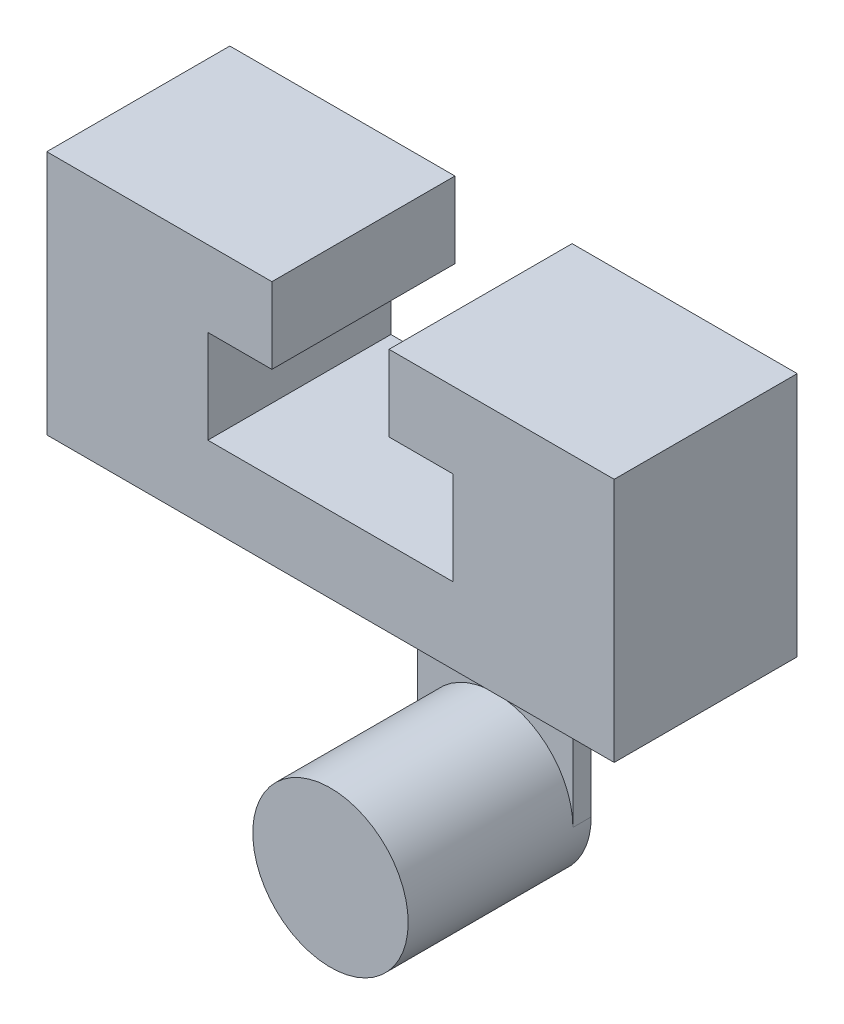
ISO-10303-21;
HEADER;
FILE_DESCRIPTION(('STEP AP214'),'2;1');
FILE_NAME('part.step','',(''),(''),'','','');
FILE_SCHEMA(('AUTOMOTIVE_DESIGN { 1 0 10303 214 1 1 1 1 }'));
ENDSEC;
DATA;
#1=APPLICATION_CONTEXT('core data for automotive mechanical design processes');
#2=APPLICATION_PROTOCOL_DEFINITION('international standard','automotive_design',2000,#1);
#3=PRODUCT_CONTEXT('',#1,'mechanical');
#4=PRODUCT('Part','Part','',(#3));
#5=PRODUCT_RELATED_PRODUCT_CATEGORY('part','',(#4));
#6=PRODUCT_DEFINITION_FORMATION('','',#4);
#7=PRODUCT_DEFINITION_CONTEXT('part definition',#1,'design');
#8=PRODUCT_DEFINITION('design','',#6,#7);
#9=PRODUCT_DEFINITION_SHAPE('','',#8);
#10=(LENGTH_UNIT() NAMED_UNIT(*) SI_UNIT(.MILLI.,.METRE.));
#11=(NAMED_UNIT(*) PLANE_ANGLE_UNIT() SI_UNIT($,.RADIAN.));
#12=(NAMED_UNIT(*) SI_UNIT($,.STERADIAN.) SOLID_ANGLE_UNIT());
#13=UNCERTAINTY_MEASURE_WITH_UNIT(LENGTH_MEASURE(1.E-05),#10,'distance_accuracy_value','');
#14=(GEOMETRIC_REPRESENTATION_CONTEXT(3) GLOBAL_UNCERTAINTY_ASSIGNED_CONTEXT((#13)) GLOBAL_UNIT_ASSIGNED_CONTEXT((#10,
#11,#12)) REPRESENTATION_CONTEXT('',''));
#15=CARTESIAN_POINT('',(0.,0.,0.));
#16=DIRECTION('',(0.,0.,1.));
#17=DIRECTION('',(1.,0.,0.));
#18=AXIS2_PLACEMENT_3D('',#15,#16,#17);
#19=CARTESIAN_POINT('',(50.1523,-33.528,25.4));
#20=DIRECTION('',(-1.,0.,0.));
#21=DIRECTION('',(0.,0.,1.));
#22=AXIS2_PLACEMENT_3D('',#19,#20,#21);
#23=PLANE('',#22);
#24=DIRECTION('',(0.,1.,0.));
#25=VECTOR('',#24,1.);
#26=CARTESIAN_POINT('',(50.1523,0.,2.54));
#27=LINE('',#26,#25);
#28=CARTESIAN_POINT('',(50.1523,-33.528,2.54));
#29=VERTEX_POINT('',#28);
#30=CARTESIAN_POINT('',(50.1523,0.,2.54));
#31=VERTEX_POINT('',#30);
#32=EDGE_CURVE('E200',#29,#31,#27,.T.);
#33=ORIENTED_EDGE('',*,*,#32,.F.);
#34=DIRECTION('',(0.,0.,-1.));
#35=VECTOR('',#34,1.);
#36=CARTESIAN_POINT('',(50.1523,-33.528,25.4));
#37=LINE('',#36,#35);
#38=CARTESIAN_POINT('',(50.1523,-33.528,0.));
#39=VERTEX_POINT('',#38);
#40=EDGE_CURVE('E13',#29,#39,#37,.T.);
#41=ORIENTED_EDGE('',*,*,#40,.T.);
#42=DIRECTION('',(0.,1.,0.));
#43=VECTOR('',#42,1.);
#44=CARTESIAN_POINT('',(50.1523,-33.528,0.));
#45=LINE('',#44,#43);
#46=CARTESIAN_POINT('',(50.1523,0.,0.));
#47=VERTEX_POINT('',#46);
#48=EDGE_CURVE('E233',#39,#47,#45,.T.);
#49=ORIENTED_EDGE('',*,*,#48,.T.);
#50=DIRECTION('',(0.,0.,-1.));
#51=VECTOR('',#50,1.);
#52=CARTESIAN_POINT('',(50.1523,0.,25.4));
#53=LINE('',#52,#51);
#54=EDGE_CURVE('E76',#31,#47,#53,.T.);
#55=ORIENTED_EDGE('',*,*,#54,.F.);
#56=EDGE_LOOP('',(#33,#41,#49,#55));
#57=FACE_BOUND('',#56,.T.);
#58=ADVANCED_FACE('F72',(#57),#23,.F.);
#59=CARTESIAN_POINT('',(39.37,-33.528,25.4));
#60=DIRECTION('',(0.,0.,-1.));
#61=DIRECTION('',(-1.,0.,0.));
#62=AXIS2_PLACEMENT_3D('',#59,#60,#61);
#63=CYLINDRICAL_SURFACE('',#62,10.7823);
#64=ORIENTED_EDGE('',*,*,#40,.F.);
#65=CARTESIAN_POINT('',(39.37,-33.528,2.54));
#66=DIRECTION('',(0.,0.,1.));
#67=DIRECTION('',(1.,0.,0.));
#68=AXIS2_PLACEMENT_3D('',#65,#66,#67);
#69=CIRCLE('',#68,10.7823);
#70=CARTESIAN_POINT('',(28.5877,-33.528,2.54));
#71=VERTEX_POINT('',#70);
#72=EDGE_CURVE('E191',#29,#71,#69,.T.);
#73=ORIENTED_EDGE('',*,*,#72,.T.);
#74=DIRECTION('',(0.,0.,-1.));
#75=VECTOR('',#74,1.);
#76=CARTESIAN_POINT('',(28.5877,-33.528,25.4));
#77=LINE('',#76,#75);
#78=CARTESIAN_POINT('',(28.5877,-33.528,0.));
#79=VERTEX_POINT('',#78);
#80=EDGE_CURVE('E129',#71,#79,#77,.T.);
#81=ORIENTED_EDGE('',*,*,#80,.T.);
#82=CARTESIAN_POINT('',(39.37,-33.528,0.));
#83=DIRECTION('',(0.,0.,1.));
#84=DIRECTION('',(1.,0.,0.));
#85=AXIS2_PLACEMENT_3D('',#82,#83,#84);
#86=CIRCLE('',#85,10.7823);
#87=EDGE_CURVE('E192',#79,#39,#86,.T.);
#88=ORIENTED_EDGE('',*,*,#87,.T.);
#89=EDGE_LOOP('',(#64,#73,#81,#88));
#90=FACE_BOUND('',#89,.T.);
#91=CARTESIAN_POINT('',(39.37,-33.528,25.4));
#92=DIRECTION('',(0.,0.,1.));
#93=DIRECTION('',(1.,0.,0.));
#94=AXIS2_PLACEMENT_3D('',#91,#92,#93);
#95=CIRCLE('',#94,10.7823);
#96=CARTESIAN_POINT('',(50.1523,-33.528,25.4));
#97=VERTEX_POINT('',#96);
#98=EDGE_CURVE('E207',#97,#97,#95,.T.);
#99=ORIENTED_EDGE('',*,*,#98,.F.);
#100=EDGE_LOOP('',(#99));
#101=FACE_BOUND('',#100,.T.);
#102=ADVANCED_FACE('F71',(#90,#101),#63,.T.);
#103=CARTESIAN_POINT('',(0.,34.036,25.4));
#104=DIRECTION('',(0.,1.,0.));
#105=DIRECTION('',(0.,0.,1.));
#106=AXIS2_PLACEMENT_3D('',#103,#104,#105);
#107=PLANE('',#106);
#108=DIRECTION('',(1.,0.,0.));
#109=VECTOR('',#108,1.);
#110=CARTESIAN_POINT('',(0.,34.036,0.));
#111=LINE('',#110,#109);
#112=CARTESIAN_POINT('',(47.498,34.036,0.));
#113=VERTEX_POINT('',#112);
#114=CARTESIAN_POINT('',(78.74,34.036,0.));
#115=VERTEX_POINT('',#114);
#116=EDGE_CURVE('E244',#113,#115,#111,.T.);
#117=ORIENTED_EDGE('',*,*,#116,.F.);
#118=DIRECTION('',(0.,0.,1.));
#119=VECTOR('',#118,1.);
#120=CARTESIAN_POINT('',(47.498,34.036,0.));
#121=LINE('',#120,#119);
#122=CARTESIAN_POINT('',(47.498,34.036,25.4));
#123=VERTEX_POINT('',#122);
#124=EDGE_CURVE('E395',#113,#123,#121,.T.);
#125=ORIENTED_EDGE('',*,*,#124,.T.);
#126=DIRECTION('',(1.,0.,0.));
#127=VECTOR('',#126,1.);
#128=CARTESIAN_POINT('',(0.,34.036,25.4));
#129=LINE('',#128,#127);
#130=CARTESIAN_POINT('',(78.74,34.036,25.4));
#131=VERTEX_POINT('',#130);
#132=EDGE_CURVE('E297',#123,#131,#129,.T.);
#133=ORIENTED_EDGE('',*,*,#132,.T.);
#134=DIRECTION('',(0.,0.,-1.));
#135=VECTOR('',#134,1.);
#136=CARTESIAN_POINT('',(78.74,34.036,25.4));
#137=LINE('',#136,#135);
#138=EDGE_CURVE('E275',#131,#115,#137,.T.);
#139=ORIENTED_EDGE('',*,*,#138,.T.);
#140=EDGE_LOOP('',(#117,#125,#133,#139));
#141=FACE_BOUND('',#140,.T.);
#142=ADVANCED_FACE('F418',(#141),#107,.T.);
#143=CARTESIAN_POINT('',(78.74,0.,25.4));
#144=DIRECTION('',(-1.,0.,0.));
#145=DIRECTION('',(0.,0.,1.));
#146=AXIS2_PLACEMENT_3D('',#143,#144,#145);
#147=PLANE('',#146);
#148=DIRECTION('',(0.,1.,0.));
#149=VECTOR('',#148,1.);
#150=CARTESIAN_POINT('',(78.74,0.,0.));
#151=LINE('',#150,#149);
#152=CARTESIAN_POINT('',(78.74,0.,0.));
#153=VERTEX_POINT('',#152);
#154=EDGE_CURVE('E238',#153,#115,#151,.T.);
#155=ORIENTED_EDGE('',*,*,#154,.T.);
#156=ORIENTED_EDGE('',*,*,#138,.F.);
#157=DIRECTION('',(0.,1.,0.));
#158=VECTOR('',#157,1.);
#159=CARTESIAN_POINT('',(78.74,0.,25.4));
#160=LINE('',#159,#158);
#161=CARTESIAN_POINT('',(78.74,0.,25.4));
#162=VERTEX_POINT('',#161);
#163=EDGE_CURVE('E291',#162,#131,#160,.T.);
#164=ORIENTED_EDGE('',*,*,#163,.F.);
#165=DIRECTION('',(0.,0.,-1.));
#166=VECTOR('',#165,1.);
#167=CARTESIAN_POINT('',(78.74,0.,25.4));
#168=LINE('',#167,#166);
#169=EDGE_CURVE('E277',#162,#153,#168,.T.);
#170=ORIENTED_EDGE('',*,*,#169,.T.);
#171=EDGE_LOOP('',(#155,#156,#164,#170));
#172=FACE_BOUND('',#171,.T.);
#173=ADVANCED_FACE('F292',(#172),#147,.F.);
#174=DIRECTION('',(0.,0.,1.));
#175=VECTOR('',#174,1.);
#176=CARTESIAN_POINT('',(31.242,34.036,0.));
#177=LINE('',#176,#175);
#178=CARTESIAN_POINT('',(31.242,34.036,0.));
#179=VERTEX_POINT('',#178);
#180=CARTESIAN_POINT('',(31.242,34.036,25.4));
#181=VERTEX_POINT('',#180);
#182=EDGE_CURVE('E372',#179,#181,#177,.T.);
#183=ORIENTED_EDGE('',*,*,#182,.F.);
#184=CARTESIAN_POINT('',(0.,34.036,0.));
#185=VERTEX_POINT('',#184);
#186=EDGE_CURVE('E241',#185,#179,#111,.T.);
#187=ORIENTED_EDGE('',*,*,#186,.F.);
#188=DIRECTION('',(0.,0.,-1.));
#189=VECTOR('',#188,1.);
#190=CARTESIAN_POINT('',(0.,34.036,25.4));
#191=LINE('',#190,#189);
#192=CARTESIAN_POINT('',(0.,34.036,25.4));
#193=VERTEX_POINT('',#192);
#194=EDGE_CURVE('E267',#193,#185,#191,.T.);
#195=ORIENTED_EDGE('',*,*,#194,.F.);
#196=EDGE_CURVE('E230',#193,#181,#129,.T.);
#197=ORIENTED_EDGE('',*,*,#196,.T.);
#198=EDGE_LOOP('',(#183,#187,#195,#197));
#199=FACE_BOUND('',#198,.T.);
#200=ADVANCED_FACE('F445',(#199),#107,.T.);
#201=CARTESIAN_POINT('',(0.,0.,25.4));
#202=DIRECTION('',(-1.,0.,0.));
#203=DIRECTION('',(0.,0.,1.));
#204=AXIS2_PLACEMENT_3D('',#201,#202,#203);
#205=PLANE('',#204);
#206=DIRECTION('',(0.,1.,0.));
#207=VECTOR('',#206,1.);
#208=CARTESIAN_POINT('',(0.,0.,0.));
#209=LINE('',#208,#207);
#210=CARTESIAN_POINT('',(0.,0.,0.));
#211=VERTEX_POINT('',#210);
#212=EDGE_CURVE('E247',#211,#185,#209,.T.);
#213=ORIENTED_EDGE('',*,*,#212,.F.);
#214=DIRECTION('',(0.,0.,-1.));
#215=VECTOR('',#214,1.);
#216=CARTESIAN_POINT('',(0.,0.,25.4));
#217=LINE('',#216,#215);
#218=CARTESIAN_POINT('',(0.,0.,25.4));
#219=VERTEX_POINT('',#218);
#220=EDGE_CURVE('E266',#219,#211,#217,.T.);
#221=ORIENTED_EDGE('',*,*,#220,.F.);
#222=DIRECTION('',(0.,1.,0.));
#223=VECTOR('',#222,1.);
#224=CARTESIAN_POINT('',(0.,0.,25.4));
#225=LINE('',#224,#223);
#226=EDGE_CURVE('E225',#219,#193,#225,.T.);
#227=ORIENTED_EDGE('',*,*,#226,.T.);
#228=ORIENTED_EDGE('',*,*,#194,.T.);
#229=EDGE_LOOP('',(#213,#221,#227,#228));
#230=FACE_BOUND('',#229,.T.);
#231=ADVANCED_FACE('F438',(#230),#205,.T.);
#232=CARTESIAN_POINT('',(0.,0.,25.4));
#233=DIRECTION('',(0.,1.,0.));
#234=DIRECTION('',(0.,0.,1.));
#235=AXIS2_PLACEMENT_3D('',#232,#233,#234);
#236=PLANE('',#235);
#237=DIRECTION('',(1.,0.,0.));
#238=VECTOR('',#237,1.);
#239=CARTESIAN_POINT('',(0.,0.,0.));
#240=LINE('',#239,#238);
#241=CARTESIAN_POINT('',(28.5877,0.,0.));
#242=VERTEX_POINT('',#241);
#243=EDGE_CURVE('E251',#211,#242,#240,.T.);
#244=ORIENTED_EDGE('',*,*,#243,.T.);
#245=DIRECTION('',(0.,0.,-1.));
#246=VECTOR('',#245,1.);
#247=CARTESIAN_POINT('',(28.5877,0.,25.4));
#248=LINE('',#247,#246);
#249=CARTESIAN_POINT('',(28.5877,0.,2.54));
#250=VERTEX_POINT('',#249);
#251=EDGE_CURVE('E263',#250,#242,#248,.T.);
#252=ORIENTED_EDGE('',*,*,#251,.F.);
#253=DIRECTION('',(-1.,0.,0.));
#254=VECTOR('',#253,1.);
#255=CARTESIAN_POINT('',(28.5877,0.,2.54));
#256=LINE('',#255,#254);
#257=EDGE_CURVE('E201',#31,#250,#256,.T.);
#258=ORIENTED_EDGE('',*,*,#257,.F.);
#259=ORIENTED_EDGE('',*,*,#54,.T.);
#260=DIRECTION('',(1.,0.,0.));
#261=VECTOR('',#260,1.);
#262=CARTESIAN_POINT('',(50.1523,0.,0.));
#263=LINE('',#262,#261);
#264=EDGE_CURVE('E240',#47,#153,#263,.T.);
#265=ORIENTED_EDGE('',*,*,#264,.T.);
#266=ORIENTED_EDGE('',*,*,#169,.F.);
#267=DIRECTION('',(1.,0.,0.));
#268=VECTOR('',#267,1.);
#269=CARTESIAN_POINT('',(50.1523,0.,25.4));
#270=LINE('',#269,#268);
#271=EDGE_CURVE('E96',#219,#162,#270,.T.);
#272=ORIENTED_EDGE('',*,*,#271,.F.);
#273=ORIENTED_EDGE('',*,*,#220,.T.);
#274=EDGE_LOOP('',(#244,#252,#258,#259,#265,#266,#272,#273));
#275=FACE_BOUND('',#274,.T.);
#276=ADVANCED_FACE('F282',(#275),#236,.F.);
#277=CARTESIAN_POINT('',(28.5877,-33.528,25.4));
#278=DIRECTION('',(-1.,0.,0.));
#279=DIRECTION('',(0.,-1.,0.));
#280=AXIS2_PLACEMENT_3D('',#277,#278,#279);
#281=PLANE('',#280);
#282=DIRECTION('',(0.,-1.,0.));
#283=VECTOR('',#282,1.);
#284=CARTESIAN_POINT('',(28.5877,0.,2.54));
#285=LINE('',#284,#283);
#286=EDGE_CURVE('E204',#250,#71,#285,.T.);
#287=ORIENTED_EDGE('',*,*,#286,.F.);
#288=ORIENTED_EDGE('',*,*,#251,.T.);
#289=DIRECTION('',(0.,1.,0.));
#290=VECTOR('',#289,1.);
#291=CARTESIAN_POINT('',(28.5877,-33.528,0.));
#292=LINE('',#291,#290);
#293=EDGE_CURVE('E260',#79,#242,#292,.T.);
#294=ORIENTED_EDGE('',*,*,#293,.F.);
#295=ORIENTED_EDGE('',*,*,#80,.F.);
#296=EDGE_LOOP('',(#287,#288,#294,#295));
#297=FACE_BOUND('',#296,.T.);
#298=ADVANCED_FACE('F433',(#297),#281,.T.);
#299=CARTESIAN_POINT('',(39.37,-33.528,25.4));
#300=DIRECTION('',(0.,0.,1.));
#301=DIRECTION('',(1.,0.,0.));
#302=AXIS2_PLACEMENT_3D('',#299,#300,#301);
#303=PLANE('',#302);
#304=ORIENTED_EDGE('',*,*,#226,.F.);
#305=ORIENTED_EDGE('',*,*,#271,.T.);
#306=ORIENTED_EDGE('',*,*,#163,.T.);
#307=ORIENTED_EDGE('',*,*,#132,.F.);
#308=DIRECTION('',(0.,1.,0.));
#309=VECTOR('',#308,1.);
#310=CARTESIAN_POINT('',(47.498,23.495,25.4));
#311=LINE('',#310,#309);
#312=CARTESIAN_POINT('',(47.498,23.495,25.4));
#313=VERTEX_POINT('',#312);
#314=EDGE_CURVE('E357',#313,#123,#311,.T.);
#315=ORIENTED_EDGE('',*,*,#314,.F.);
#316=DIRECTION('',(-1.,0.,0.));
#317=VECTOR('',#316,1.);
#318=CARTESIAN_POINT('',(47.498,23.495,25.4));
#319=LINE('',#318,#317);
#320=CARTESIAN_POINT('',(56.388,23.495,25.4));
#321=VERTEX_POINT('',#320);
#322=EDGE_CURVE('E351',#321,#313,#319,.T.);
#323=ORIENTED_EDGE('',*,*,#322,.F.);
#324=DIRECTION('',(0.,1.,0.));
#325=VECTOR('',#324,1.);
#326=CARTESIAN_POINT('',(56.388,10.541,25.4));
#327=LINE('',#326,#325);
#328=CARTESIAN_POINT('',(56.388,10.541,25.4));
#329=VERTEX_POINT('',#328);
#330=EDGE_CURVE('E355',#329,#321,#327,.T.);
#331=ORIENTED_EDGE('',*,*,#330,.F.);
#332=DIRECTION('',(1.,0.,0.));
#333=VECTOR('',#332,1.);
#334=CARTESIAN_POINT('',(22.352,10.541,25.4));
#335=LINE('',#334,#333);
#336=CARTESIAN_POINT('',(22.352,10.541,25.4));
#337=VERTEX_POINT('',#336);
#338=EDGE_CURVE('E323',#337,#329,#335,.T.);
#339=ORIENTED_EDGE('',*,*,#338,.F.);
#340=DIRECTION('',(0.,-1.,0.));
#341=VECTOR('',#340,1.);
#342=CARTESIAN_POINT('',(22.352,10.541,25.4));
#343=LINE('',#342,#341);
#344=CARTESIAN_POINT('',(22.352,23.495,25.4));
#345=VERTEX_POINT('',#344);
#346=EDGE_CURVE('E320',#345,#337,#343,.T.);
#347=ORIENTED_EDGE('',*,*,#346,.F.);
#348=DIRECTION('',(-1.,0.,0.));
#349=VECTOR('',#348,1.);
#350=CARTESIAN_POINT('',(22.352,23.495,25.4));
#351=LINE('',#350,#349);
#352=CARTESIAN_POINT('',(31.242,23.495,25.4));
#353=VERTEX_POINT('',#352);
#354=EDGE_CURVE('E313',#353,#345,#351,.T.);
#355=ORIENTED_EDGE('',*,*,#354,.F.);
#356=DIRECTION('',(0.,-1.,0.));
#357=VECTOR('',#356,1.);
#358=CARTESIAN_POINT('',(31.242,23.495,25.4));
#359=LINE('',#358,#357);
#360=EDGE_CURVE('E318',#181,#353,#359,.T.);
#361=ORIENTED_EDGE('',*,*,#360,.F.);
#362=ORIENTED_EDGE('',*,*,#196,.F.);
#363=EDGE_LOOP('',(#304,#305,#306,#307,#315,#323,#331,#339,#347,#355,#361,#362));
#364=FACE_BOUND('',#363,.T.);
#365=ADVANCED_FACE('F378',(#364),#303,.T.);
#366=CARTESIAN_POINT('',(39.37,-33.528,0.));
#367=DIRECTION('',(0.,0.,1.));
#368=DIRECTION('',(1.,0.,0.));
#369=AXIS2_PLACEMENT_3D('',#366,#367,#368);
#370=PLANE('',#369);
#371=DIRECTION('',(-1.,0.,0.));
#372=VECTOR('',#371,1.);
#373=CARTESIAN_POINT('',(47.498,23.495,0.));
#374=LINE('',#373,#372);
#375=CARTESIAN_POINT('',(56.388,23.495,0.));
#376=VERTEX_POINT('',#375);
#377=CARTESIAN_POINT('',(47.498,23.495,0.));
#378=VERTEX_POINT('',#377);
#379=EDGE_CURVE('E409',#376,#378,#374,.T.);
#380=ORIENTED_EDGE('',*,*,#379,.T.);
#381=DIRECTION('',(0.,1.,0.));
#382=VECTOR('',#381,1.);
#383=CARTESIAN_POINT('',(47.498,23.495,0.));
#384=LINE('',#383,#382);
#385=EDGE_CURVE('E87',#378,#113,#384,.T.);
#386=ORIENTED_EDGE('',*,*,#385,.T.);
#387=ORIENTED_EDGE('',*,*,#116,.T.);
#388=ORIENTED_EDGE('',*,*,#154,.F.);
#389=ORIENTED_EDGE('',*,*,#264,.F.);
#390=ORIENTED_EDGE('',*,*,#48,.F.);
#391=ORIENTED_EDGE('',*,*,#87,.F.);
#392=ORIENTED_EDGE('',*,*,#293,.T.);
#393=ORIENTED_EDGE('',*,*,#243,.F.);
#394=ORIENTED_EDGE('',*,*,#212,.T.);
#395=ORIENTED_EDGE('',*,*,#186,.T.);
#396=DIRECTION('',(0.,-1.,0.));
#397=VECTOR('',#396,1.);
#398=CARTESIAN_POINT('',(31.242,23.495,0.));
#399=LINE('',#398,#397);
#400=CARTESIAN_POINT('',(31.242,23.495,0.));
#401=VERTEX_POINT('',#400);
#402=EDGE_CURVE('E342',#179,#401,#399,.T.);
#403=ORIENTED_EDGE('',*,*,#402,.T.);
#404=DIRECTION('',(-1.,0.,0.));
#405=VECTOR('',#404,1.);
#406=CARTESIAN_POINT('',(22.352,23.495,0.));
#407=LINE('',#406,#405);
#408=CARTESIAN_POINT('',(22.352,23.495,0.));
#409=VERTEX_POINT('',#408);
#410=EDGE_CURVE('E333',#401,#409,#407,.T.);
#411=ORIENTED_EDGE('',*,*,#410,.T.);
#412=DIRECTION('',(0.,-1.,0.));
#413=VECTOR('',#412,1.);
#414=CARTESIAN_POINT('',(22.352,10.541,0.));
#415=LINE('',#414,#413);
#416=CARTESIAN_POINT('',(22.352,10.541,0.));
#417=VERTEX_POINT('',#416);
#418=EDGE_CURVE('E336',#409,#417,#415,.T.);
#419=ORIENTED_EDGE('',*,*,#418,.T.);
#420=DIRECTION('',(1.,0.,0.));
#421=VECTOR('',#420,1.);
#422=CARTESIAN_POINT('',(22.352,10.541,0.));
#423=LINE('',#422,#421);
#424=CARTESIAN_POINT('',(56.388,10.541,0.));
#425=VERTEX_POINT('',#424);
#426=EDGE_CURVE('E350',#417,#425,#423,.T.);
#427=ORIENTED_EDGE('',*,*,#426,.T.);
#428=DIRECTION('',(0.,1.,0.));
#429=VECTOR('',#428,1.);
#430=CARTESIAN_POINT('',(56.388,10.541,0.));
#431=LINE('',#430,#429);
#432=EDGE_CURVE('E327',#425,#376,#431,.T.);
#433=ORIENTED_EDGE('',*,*,#432,.T.);
#434=EDGE_LOOP('',(#380,#386,#387,#388,#389,#390,#391,#392,#393,#394,#395,#403,#411,#419,#427,#433));
#435=FACE_BOUND('',#434,.T.);
#436=ADVANCED_FACE('F290',(#435),#370,.F.);
#437=CARTESIAN_POINT('',(56.388,10.541,0.));
#438=DIRECTION('',(1.,0.,0.));
#439=DIRECTION('',(0.,0.,-1.));
#440=AXIS2_PLACEMENT_3D('',#437,#438,#439);
#441=PLANE('',#440);
#442=ORIENTED_EDGE('',*,*,#330,.T.);
#443=DIRECTION('',(0.,0.,1.));
#444=VECTOR('',#443,1.);
#445=CARTESIAN_POINT('',(56.388,23.495,0.));
#446=LINE('',#445,#444);
#447=EDGE_CURVE('E352',#376,#321,#446,.T.);
#448=ORIENTED_EDGE('',*,*,#447,.F.);
#449=ORIENTED_EDGE('',*,*,#432,.F.);
#450=DIRECTION('',(0.,0.,1.));
#451=VECTOR('',#450,1.);
#452=CARTESIAN_POINT('',(56.388,10.541,0.));
#453=LINE('',#452,#451);
#454=EDGE_CURVE('E234',#425,#329,#453,.T.);
#455=ORIENTED_EDGE('',*,*,#454,.T.);
#456=EDGE_LOOP('',(#442,#448,#449,#455));
#457=FACE_BOUND('',#456,.T.);
#458=ADVANCED_FACE('F412',(#457),#441,.F.);
#459=CARTESIAN_POINT('',(22.352,10.541,0.));
#460=DIRECTION('',(0.,-1.,0.));
#461=DIRECTION('',(0.,0.,-1.));
#462=AXIS2_PLACEMENT_3D('',#459,#460,#461);
#463=PLANE('',#462);
#464=ORIENTED_EDGE('',*,*,#338,.T.);
#465=ORIENTED_EDGE('',*,*,#454,.F.);
#466=ORIENTED_EDGE('',*,*,#426,.F.);
#467=DIRECTION('',(0.,0.,1.));
#468=VECTOR('',#467,1.);
#469=CARTESIAN_POINT('',(22.352,10.541,0.));
#470=LINE('',#469,#468);
#471=EDGE_CURVE('E388',#417,#337,#470,.T.);
#472=ORIENTED_EDGE('',*,*,#471,.T.);
#473=EDGE_LOOP('',(#464,#465,#466,#472));
#474=FACE_BOUND('',#473,.T.);
#475=ADVANCED_FACE('F448',(#474),#463,.F.);
#476=CARTESIAN_POINT('',(22.352,10.541,0.));
#477=DIRECTION('',(-1.,0.,0.));
#478=DIRECTION('',(0.,0.,1.));
#479=AXIS2_PLACEMENT_3D('',#476,#477,#478);
#480=PLANE('',#479);
#481=ORIENTED_EDGE('',*,*,#346,.T.);
#482=ORIENTED_EDGE('',*,*,#471,.F.);
#483=ORIENTED_EDGE('',*,*,#418,.F.);
#484=DIRECTION('',(0.,0.,1.));
#485=VECTOR('',#484,1.);
#486=CARTESIAN_POINT('',(22.352,23.495,0.));
#487=LINE('',#486,#485);
#488=EDGE_CURVE('E385',#409,#345,#487,.T.);
#489=ORIENTED_EDGE('',*,*,#488,.T.);
#490=EDGE_LOOP('',(#481,#482,#483,#489));
#491=FACE_BOUND('',#490,.T.);
#492=ADVANCED_FACE('F443',(#491),#480,.F.);
#493=CARTESIAN_POINT('',(22.352,23.495,0.));
#494=DIRECTION('',(0.,1.,0.));
#495=DIRECTION('',(-1.,0.,0.));
#496=AXIS2_PLACEMENT_3D('',#493,#494,#495);
#497=PLANE('',#496);
#498=ORIENTED_EDGE('',*,*,#354,.T.);
#499=ORIENTED_EDGE('',*,*,#488,.F.);
#500=ORIENTED_EDGE('',*,*,#410,.F.);
#501=DIRECTION('',(0.,0.,1.));
#502=VECTOR('',#501,1.);
#503=CARTESIAN_POINT('',(31.242,23.495,0.));
#504=LINE('',#503,#502);
#505=EDGE_CURVE('E371',#401,#353,#504,.T.);
#506=ORIENTED_EDGE('',*,*,#505,.T.);
#507=EDGE_LOOP('',(#498,#499,#500,#506));
#508=FACE_BOUND('',#507,.T.);
#509=ADVANCED_FACE('F381',(#508),#497,.F.);
#510=CARTESIAN_POINT('',(31.242,23.495,0.));
#511=DIRECTION('',(-1.,0.,0.));
#512=DIRECTION('',(0.,0.,1.));
#513=AXIS2_PLACEMENT_3D('',#510,#511,#512);
#514=PLANE('',#513);
#515=ORIENTED_EDGE('',*,*,#360,.T.);
#516=ORIENTED_EDGE('',*,*,#505,.F.);
#517=ORIENTED_EDGE('',*,*,#402,.F.);
#518=ORIENTED_EDGE('',*,*,#182,.T.);
#519=EDGE_LOOP('',(#515,#516,#517,#518));
#520=FACE_BOUND('',#519,.T.);
#521=ADVANCED_FACE('F367',(#520),#514,.F.);
#522=CARTESIAN_POINT('',(47.498,23.495,0.));
#523=DIRECTION('',(1.,0.,0.));
#524=DIRECTION('',(0.,0.,-1.));
#525=AXIS2_PLACEMENT_3D('',#522,#523,#524);
#526=PLANE('',#525);
#527=ORIENTED_EDGE('',*,*,#314,.T.);
#528=ORIENTED_EDGE('',*,*,#124,.F.);
#529=ORIENTED_EDGE('',*,*,#385,.F.);
#530=DIRECTION('',(0.,0.,1.));
#531=VECTOR('',#530,1.);
#532=CARTESIAN_POINT('',(47.498,23.495,0.));
#533=LINE('',#532,#531);
#534=EDGE_CURVE('E396',#378,#313,#533,.T.);
#535=ORIENTED_EDGE('',*,*,#534,.T.);
#536=EDGE_LOOP('',(#527,#528,#529,#535));
#537=FACE_BOUND('',#536,.T.);
#538=ADVANCED_FACE('F423',(#537),#526,.F.);
#539=CARTESIAN_POINT('',(47.498,23.495,0.));
#540=DIRECTION('',(0.,1.,0.));
#541=DIRECTION('',(-1.,0.,0.));
#542=AXIS2_PLACEMENT_3D('',#539,#540,#541);
#543=PLANE('',#542);
#544=ORIENTED_EDGE('',*,*,#322,.T.);
#545=ORIENTED_EDGE('',*,*,#534,.F.);
#546=ORIENTED_EDGE('',*,*,#379,.F.);
#547=ORIENTED_EDGE('',*,*,#447,.T.);
#548=EDGE_LOOP('',(#544,#545,#546,#547));
#549=FACE_BOUND('',#548,.T.);
#550=ADVANCED_FACE('F410',(#549),#543,.F.);
#551=CARTESIAN_POINT('',(39.37,-33.528,2.54));
#552=DIRECTION('',(0.,0.,1.));
#553=DIRECTION('',(1.,0.,0.));
#554=AXIS2_PLACEMENT_3D('',#551,#552,#553);
#555=PLANE('',#554);
#556=ORIENTED_EDGE('',*,*,#72,.F.);
#557=ORIENTED_EDGE('',*,*,#32,.T.);
#558=ORIENTED_EDGE('',*,*,#257,.T.);
#559=ORIENTED_EDGE('',*,*,#286,.T.);
#560=EDGE_LOOP('',(#556,#557,#558,#559));
#561=FACE_BOUND('',#560,.T.);
#562=ADVANCED_FACE('F206',(#561),#555,.T.);
#563=CARTESIAN_POINT('',(39.37,-33.528,25.4));
#564=DIRECTION('',(0.,0.,1.));
#565=DIRECTION('',(1.,0.,0.));
#566=AXIS2_PLACEMENT_3D('',#563,#564,#565);
#567=PLANE('',#566);
#568=ORIENTED_EDGE('',*,*,#98,.T.);
#569=EDGE_LOOP('',(#568));
#570=FACE_BOUND('',#569,.T.);
#571=ADVANCED_FACE('F508',(#570),#567,.T.);
#572=CLOSED_SHELL('',(#58,#102,#142,#173,#200,#231,#276,#298,#365,#436,#458,#475,#492,#509,#521,
#538,#550,#562,#571));
#573=MANIFOLD_SOLID_BREP('B2',#572);
#574=ADVANCED_BREP_SHAPE_REPRESENTATION('',(#18,#573),#14);
#575=SHAPE_DEFINITION_REPRESENTATION(#9,#574);
ENDSEC;
END-ISO-10303-21;
